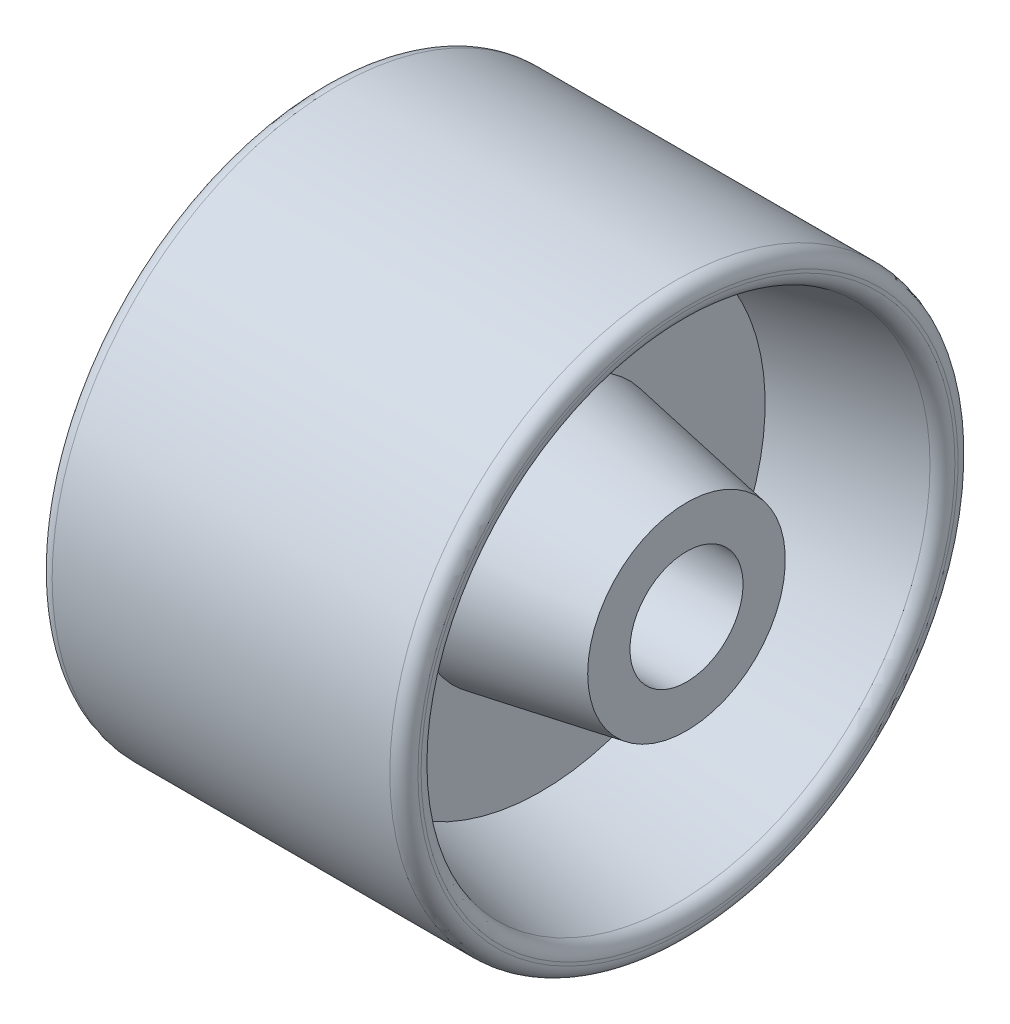
ISO-10303-21;
HEADER;
FILE_DESCRIPTION(('STEP AP214'),'2;1');
FILE_NAME('part.step','',(''),(''),'','','');
FILE_SCHEMA(('AUTOMOTIVE_DESIGN { 1 0 10303 214 1 1 1 1 }'));
ENDSEC;
DATA;
#1=APPLICATION_CONTEXT('core data for automotive mechanical design processes');
#2=APPLICATION_PROTOCOL_DEFINITION('international standard','automotive_design',2000,#1);
#3=PRODUCT_CONTEXT('',#1,'mechanical');
#4=PRODUCT('Part','Part','',(#3));
#5=PRODUCT_RELATED_PRODUCT_CATEGORY('part','',(#4));
#6=PRODUCT_DEFINITION_FORMATION('','',#4);
#7=PRODUCT_DEFINITION_CONTEXT('part definition',#1,'design');
#8=PRODUCT_DEFINITION('design','',#6,#7);
#9=PRODUCT_DEFINITION_SHAPE('','',#8);
#10=(LENGTH_UNIT() NAMED_UNIT(*) SI_UNIT(.MILLI.,.METRE.));
#11=(NAMED_UNIT(*) PLANE_ANGLE_UNIT() SI_UNIT($,.RADIAN.));
#12=(NAMED_UNIT(*) SI_UNIT($,.STERADIAN.) SOLID_ANGLE_UNIT());
#13=UNCERTAINTY_MEASURE_WITH_UNIT(LENGTH_MEASURE(1.E-05),#10,'distance_accuracy_value','');
#14=(GEOMETRIC_REPRESENTATION_CONTEXT(3) GLOBAL_UNCERTAINTY_ASSIGNED_CONTEXT((#13)) GLOBAL_UNIT_ASSIGNED_CONTEXT((#10,
#11,#12)) REPRESENTATION_CONTEXT('',''));
#15=CARTESIAN_POINT('',(0.,0.,0.));
#16=DIRECTION('',(0.,0.,1.));
#17=DIRECTION('',(1.,0.,0.));
#18=AXIS2_PLACEMENT_3D('',#15,#16,#17);
#19=CARTESIAN_POINT('',(-64.9384843005096,90.7268124280783,0.));
#20=DIRECTION('',(1.,0.,0.));
#21=DIRECTION('',(0.,0.,-1.));
#22=AXIS2_PLACEMENT_3D('',#19,#20,#21);
#23=PLANE('',#22);
#24=CARTESIAN_POINT('',(-64.9384843005096,0.,0.));
#25=DIRECTION('',(1.,0.,0.));
#26=DIRECTION('',(0.,0.,-1.));
#27=AXIS2_PLACEMENT_3D('',#24,#25,#26);
#28=CIRCLE('',#27,94.764550954195);
#29=CARTESIAN_POINT('',(-64.9384843005096,0.,-94.764550954195));
#30=VERTEX_POINT('',#29);
#31=EDGE_CURVE('E10',#30,#30,#28,.T.);
#32=ORIENTED_EDGE('',*,*,#31,.T.);
#33=EDGE_LOOP('',(#32));
#34=FACE_BOUND('',#33,.T.);
#35=CARTESIAN_POINT('',(-64.9384843005096,0.,0.));
#36=DIRECTION('',(1.,0.,0.));
#37=DIRECTION('',(0.,0.,-1.));
#38=AXIS2_PLACEMENT_3D('',#35,#36,#37);
#39=CIRCLE('',#38,95.8778029984711);
#40=CARTESIAN_POINT('',(-64.9384843005096,0.,-95.8778029984711));
#41=VERTEX_POINT('',#40);
#42=EDGE_CURVE('E72',#41,#41,#39,.F.);
#43=ORIENTED_EDGE('',*,*,#42,.T.);
#44=EDGE_LOOP('',(#43));
#45=FACE_BOUND('',#44,.T.);
#46=ADVANCED_FACE('F36',(#34,#45),#23,.F.);
#47=CARTESIAN_POINT('',(-64.9384843005096,0.,0.));
#48=DIRECTION('',(-1.,0.,0.));
#49=DIRECTION('',(0.,0.,1.));
#50=AXIS2_PLACEMENT_3D('',#47,#48,#49);
#51=CONICAL_SURFACE('',#50,90.7268124280783,0.212143753004476);
#52=CARTESIAN_POINT('',(-60.9912646802351,0.,0.));
#53=DIRECTION('',(1.,0.,0.));
#54=DIRECTION('',(0.,0.,-1.));
#55=AXIS2_PLACEMENT_3D('',#52,#53,#54);
#56=CIRCLE('',#55,89.8766420483268);
#57=CARTESIAN_POINT('',(-60.9912646802351,0.,-89.8766420483268));
#58=VERTEX_POINT('',#57);
#59=EDGE_CURVE('E44',#58,#58,#56,.F.);
#60=ORIENTED_EDGE('',*,*,#59,.T.);
#61=EDGE_LOOP('',(#60));
#62=FACE_BOUND('',#61,.T.);
#63=CARTESIAN_POINT('',(-12.8273549235575,0.,0.));
#64=DIRECTION('',(-1.,0.,0.));
#65=DIRECTION('',(0.,0.,1.));
#66=AXIS2_PLACEMENT_3D('',#63,#64,#65);
#67=CIRCLE('',#66,79.5028768699655);
#68=CARTESIAN_POINT('',(-12.8273549235575,0.,79.5028768699655));
#69=VERTEX_POINT('',#68);
#70=EDGE_CURVE('E76',#69,#69,#67,.T.);
#71=ORIENTED_EDGE('',*,*,#70,.F.);
#72=EDGE_LOOP('',(#71));
#73=FACE_BOUND('',#72,.T.);
#74=ADVANCED_FACE('F150',(#62,#73),#51,.F.);
#75=CARTESIAN_POINT('',(-12.8273549235573,79.5028768699655,0.));
#76=DIRECTION('',(1.,0.,0.));
#77=DIRECTION('',(0.,0.,-1.));
#78=AXIS2_PLACEMENT_3D('',#75,#76,#77);
#79=PLANE('',#78);
#80=CARTESIAN_POINT('',(-12.8273549235571,0.,0.));
#81=DIRECTION('',(-1.,0.,0.));
#82=DIRECTION('',(0.,0.,1.));
#83=AXIS2_PLACEMENT_3D('',#80,#81,#82);
#84=CIRCLE('',#83,44.1819995166585);
#85=CARTESIAN_POINT('',(-12.8273549235571,0.,44.1819995166585));
#86=VERTEX_POINT('',#85);
#87=EDGE_CURVE('E80',#86,#86,#84,.T.);
#88=ORIENTED_EDGE('',*,*,#87,.F.);
#89=EDGE_LOOP('',(#88));
#90=FACE_BOUND('',#89,.T.);
#91=ORIENTED_EDGE('',*,*,#70,.T.);
#92=EDGE_LOOP('',(#91));
#93=FACE_BOUND('',#92,.T.);
#94=ADVANCED_FACE('F144',(#90,#93),#79,.F.);
#95=CARTESIAN_POINT('',(-12.8273549235571,0.,0.));
#96=DIRECTION('',(1.,0.,0.));
#97=DIRECTION('',(0.,0.,-1.));
#98=AXIS2_PLACEMENT_3D('',#95,#96,#97);
#99=CONICAL_SURFACE('',#98,44.1819995166585,0.174532925199437);
#100=CARTESIAN_POINT('',(-64.4067309339064,0.,0.));
#101=DIRECTION('',(-1.,0.,0.));
#102=DIRECTION('',(0.,0.,1.));
#103=AXIS2_PLACEMENT_3D('',#100,#101,#102);
#104=CIRCLE('',#103,35.0871638779268);
#105=CARTESIAN_POINT('',(-64.4067309339064,0.,35.0871638779268));
#106=VERTEX_POINT('',#105);
#107=EDGE_CURVE('E84',#106,#106,#104,.T.);
#108=ORIENTED_EDGE('',*,*,#107,.F.);
#109=EDGE_LOOP('',(#108));
#110=FACE_BOUND('',#109,.T.);
#111=ORIENTED_EDGE('',*,*,#87,.T.);
#112=EDGE_LOOP('',(#111));
#113=FACE_BOUND('',#112,.T.);
#114=ADVANCED_FACE('F138',(#110,#113),#99,.T.);
#115=CARTESIAN_POINT('',(-64.4067309339064,20.0743372976162,0.));
#116=DIRECTION('',(1.,0.,0.));
#117=DIRECTION('',(0.,0.,-1.));
#118=AXIS2_PLACEMENT_3D('',#115,#116,#117);
#119=PLANE('',#118);
#120=CARTESIAN_POINT('',(-64.4067309339064,0.,0.));
#121=DIRECTION('',(-1.,0.,0.));
#122=DIRECTION('',(0.,0.,1.));
#123=AXIS2_PLACEMENT_3D('',#120,#121,#122);
#124=CIRCLE('',#123,20.0743372976162);
#125=CARTESIAN_POINT('',(-64.4067309339064,0.,20.0743372976162));
#126=VERTEX_POINT('',#125);
#127=EDGE_CURVE('E88',#126,#126,#124,.T.);
#128=ORIENTED_EDGE('',*,*,#127,.F.);
#129=EDGE_LOOP('',(#128));
#130=FACE_BOUND('',#129,.T.);
#131=ORIENTED_EDGE('',*,*,#107,.T.);
#132=EDGE_LOOP('',(#131));
#133=FACE_BOUND('',#132,.T.);
#134=ADVANCED_FACE('F132',(#130,#133),#119,.F.);
#135=CARTESIAN_POINT('',(-142.971560085484,0.,0.));
#136=DIRECTION('',(-1.,0.,0.));
#137=DIRECTION('',(0.,0.,1.));
#138=AXIS2_PLACEMENT_3D('',#135,#136,#137);
#139=CYLINDRICAL_SURFACE('',#138,20.0743372976162);
#140=CARTESIAN_POINT('',(64.4067309339064,0.,0.));
#141=DIRECTION('',(-1.,0.,0.));
#142=DIRECTION('',(0.,0.,1.));
#143=AXIS2_PLACEMENT_3D('',#140,#141,#142);
#144=CIRCLE('',#143,20.0743372976162);
#145=CARTESIAN_POINT('',(64.4067309339064,0.,20.0743372976162));
#146=VERTEX_POINT('',#145);
#147=EDGE_CURVE('E92',#146,#146,#144,.T.);
#148=ORIENTED_EDGE('',*,*,#147,.F.);
#149=EDGE_LOOP('',(#148));
#150=FACE_BOUND('',#149,.T.);
#151=ORIENTED_EDGE('',*,*,#127,.T.);
#152=EDGE_LOOP('',(#151));
#153=FACE_BOUND('',#152,.T.);
#154=ADVANCED_FACE('F126',(#150,#153),#139,.F.);
#155=CARTESIAN_POINT('',(64.4067309339065,20.0743372976162,0.));
#156=DIRECTION('',(-1.,0.,0.));
#157=DIRECTION('',(0.,0.,1.));
#158=AXIS2_PLACEMENT_3D('',#155,#156,#157);
#159=PLANE('',#158);
#160=CARTESIAN_POINT('',(64.4067309339064,0.,0.));
#161=DIRECTION('',(-1.,0.,0.));
#162=DIRECTION('',(0.,0.,1.));
#163=AXIS2_PLACEMENT_3D('',#160,#161,#162);
#164=CIRCLE('',#163,35.0871638779268);
#165=CARTESIAN_POINT('',(64.4067309339064,0.,35.0871638779268));
#166=VERTEX_POINT('',#165);
#167=EDGE_CURVE('E96',#166,#166,#164,.T.);
#168=ORIENTED_EDGE('',*,*,#167,.F.);
#169=EDGE_LOOP('',(#168));
#170=FACE_BOUND('',#169,.T.);
#171=ORIENTED_EDGE('',*,*,#147,.T.);
#172=EDGE_LOOP('',(#171));
#173=FACE_BOUND('',#172,.T.);
#174=ADVANCED_FACE('F120',(#170,#173),#159,.F.);
#175=CARTESIAN_POINT('',(64.4067309339064,0.,0.));
#176=DIRECTION('',(-1.,0.,0.));
#177=DIRECTION('',(0.,0.,1.));
#178=AXIS2_PLACEMENT_3D('',#175,#176,#177);
#179=CONICAL_SURFACE('',#178,35.0871638779268,0.174532925199449);
#180=CARTESIAN_POINT('',(12.8273549235575,0.,0.));
#181=DIRECTION('',(-1.,0.,0.));
#182=DIRECTION('',(0.,0.,1.));
#183=AXIS2_PLACEMENT_3D('',#180,#181,#182);
#184=CIRCLE('',#183,44.1819995166591);
#185=CARTESIAN_POINT('',(12.8273549235575,0.,44.1819995166591));
#186=VERTEX_POINT('',#185);
#187=EDGE_CURVE('E100',#186,#186,#184,.T.);
#188=ORIENTED_EDGE('',*,*,#187,.F.);
#189=EDGE_LOOP('',(#188));
#190=FACE_BOUND('',#189,.T.);
#191=ORIENTED_EDGE('',*,*,#167,.T.);
#192=EDGE_LOOP('',(#191));
#193=FACE_BOUND('',#192,.T.);
#194=ADVANCED_FACE('F114',(#190,#193),#179,.T.);
#195=CARTESIAN_POINT('',(12.8273549235575,79.5028768699655,0.));
#196=DIRECTION('',(-1.,0.,0.));
#197=DIRECTION('',(0.,0.,1.));
#198=AXIS2_PLACEMENT_3D('',#195,#196,#197);
#199=PLANE('',#198);
#200=CARTESIAN_POINT('',(12.8273549235575,0.,0.));
#201=DIRECTION('',(-1.,0.,0.));
#202=DIRECTION('',(0.,0.,1.));
#203=AXIS2_PLACEMENT_3D('',#200,#201,#202);
#204=CIRCLE('',#203,79.5028768699655);
#205=CARTESIAN_POINT('',(12.8273549235575,0.,79.5028768699655));
#206=VERTEX_POINT('',#205);
#207=EDGE_CURVE('E104',#206,#206,#204,.T.);
#208=ORIENTED_EDGE('',*,*,#207,.F.);
#209=EDGE_LOOP('',(#208));
#210=FACE_BOUND('',#209,.T.);
#211=ORIENTED_EDGE('',*,*,#187,.T.);
#212=EDGE_LOOP('',(#211));
#213=FACE_BOUND('',#212,.T.);
#214=ADVANCED_FACE('F111',(#210,#213),#199,.F.);
#215=CARTESIAN_POINT('',(12.8273549235575,0.,0.));
#216=DIRECTION('',(1.,0.,0.));
#217=DIRECTION('',(0.,0.,-1.));
#218=AXIS2_PLACEMENT_3D('',#215,#216,#217);
#219=CONICAL_SURFACE('',#218,79.5028768699655,0.212143753004476);
#220=CARTESIAN_POINT('',(60.9912646802351,0.,0.));
#221=DIRECTION('',(-1.,0.,0.));
#222=DIRECTION('',(0.,0.,1.));
#223=AXIS2_PLACEMENT_3D('',#220,#221,#222);
#224=CIRCLE('',#223,89.8766420483268);
#225=CARTESIAN_POINT('',(60.9912646802351,0.,89.8766420483268));
#226=VERTEX_POINT('',#225);
#227=EDGE_CURVE('E54',#226,#226,#224,.F.);
#228=ORIENTED_EDGE('',*,*,#227,.T.);
#229=EDGE_LOOP('',(#228));
#230=FACE_BOUND('',#229,.T.);
#231=ORIENTED_EDGE('',*,*,#207,.T.);
#232=EDGE_LOOP('',(#231));
#233=FACE_BOUND('',#232,.T.);
#234=ADVANCED_FACE('F109',(#230,#233),#219,.F.);
#235=CARTESIAN_POINT('',(64.9384843005096,90.7268124280783,0.));
#236=DIRECTION('',(-1.,0.,0.));
#237=DIRECTION('',(0.,0.,1.));
#238=AXIS2_PLACEMENT_3D('',#235,#236,#237);
#239=PLANE('',#238);
#240=CARTESIAN_POINT('',(64.9384843005096,0.,0.));
#241=DIRECTION('',(-1.,0.,0.));
#242=DIRECTION('',(0.,0.,1.));
#243=AXIS2_PLACEMENT_3D('',#240,#241,#242);
#244=CIRCLE('',#243,94.764550954195);
#245=CARTESIAN_POINT('',(64.9384843005096,0.,94.764550954195));
#246=VERTEX_POINT('',#245);
#247=EDGE_CURVE('E60',#246,#246,#244,.T.);
#248=ORIENTED_EDGE('',*,*,#247,.T.);
#249=EDGE_LOOP('',(#248));
#250=FACE_BOUND('',#249,.T.);
#251=CARTESIAN_POINT('',(64.9384843005096,0.,0.));
#252=DIRECTION('',(-1.,0.,0.));
#253=DIRECTION('',(0.,0.,1.));
#254=AXIS2_PLACEMENT_3D('',#251,#252,#253);
#255=CIRCLE('',#254,95.8778029984711);
#256=CARTESIAN_POINT('',(64.9384843005096,0.,95.8778029984711));
#257=VERTEX_POINT('',#256);
#258=EDGE_CURVE('E64',#257,#257,#255,.F.);
#259=ORIENTED_EDGE('',*,*,#258,.T.);
#260=EDGE_LOOP('',(#259));
#261=FACE_BOUND('',#260,.T.);
#262=ADVANCED_FACE('F182',(#250,#261),#239,.F.);
#263=CARTESIAN_POINT('',(-142.971560085484,0.,0.));
#264=DIRECTION('',(-1.,0.,0.));
#265=DIRECTION('',(0.,0.,1.));
#266=AXIS2_PLACEMENT_3D('',#263,#264,#265);
#267=CYLINDRICAL_SURFACE('',#266,100.877802998471);
#268=CARTESIAN_POINT('',(59.9384843005096,0.,0.));
#269=DIRECTION('',(-1.,0.,0.));
#270=DIRECTION('',(0.,0.,1.));
#271=AXIS2_PLACEMENT_3D('',#268,#269,#270);
#272=CIRCLE('',#271,100.877802998471);
#273=CARTESIAN_POINT('',(59.9384843005096,0.,100.877802998471));
#274=VERTEX_POINT('',#273);
#275=EDGE_CURVE('E49',#274,#274,#272,.T.);
#276=ORIENTED_EDGE('',*,*,#275,.T.);
#277=EDGE_LOOP('',(#276));
#278=FACE_BOUND('',#277,.T.);
#279=CARTESIAN_POINT('',(-59.9384843005096,0.,0.));
#280=DIRECTION('',(1.,0.,0.));
#281=DIRECTION('',(0.,0.,-1.));
#282=AXIS2_PLACEMENT_3D('',#279,#280,#281);
#283=CIRCLE('',#282,100.877802998471);
#284=CARTESIAN_POINT('',(-59.9384843005096,0.,-100.877802998471));
#285=VERTEX_POINT('',#284);
#286=EDGE_CURVE('E68',#285,#285,#283,.T.);
#287=ORIENTED_EDGE('',*,*,#286,.T.);
#288=EDGE_LOOP('',(#287));
#289=FACE_BOUND('',#288,.T.);
#290=ADVANCED_FACE('F165',(#278,#289),#267,.T.);
#291=CARTESIAN_POINT('',(-59.9384843005096,0.,0.));
#292=DIRECTION('',(1.,0.,0.));
#293=DIRECTION('',(0.,0.,-1.));
#294=AXIS2_PLACEMENT_3D('',#291,#292,#293);
#295=TOROIDAL_SURFACE('',#294,95.8778029984711,5.);
#296=ORIENTED_EDGE('',*,*,#286,.F.);
#297=EDGE_LOOP('',(#296));
#298=FACE_BOUND('',#297,.T.);
#299=ORIENTED_EDGE('',*,*,#42,.F.);
#300=EDGE_LOOP('',(#299));
#301=FACE_BOUND('',#300,.T.);
#302=ADVANCED_FACE('F161',(#298,#301),#295,.T.);
#303=CARTESIAN_POINT('',(59.9384843005096,0.,0.));
#304=DIRECTION('',(-1.,0.,0.));
#305=DIRECTION('',(0.,0.,1.));
#306=AXIS2_PLACEMENT_3D('',#303,#304,#305);
#307=TOROIDAL_SURFACE('',#306,94.764550954195,5.);
#308=ORIENTED_EDGE('',*,*,#227,.F.);
#309=EDGE_LOOP('',(#308));
#310=FACE_BOUND('',#309,.T.);
#311=ORIENTED_EDGE('',*,*,#247,.F.);
#312=EDGE_LOOP('',(#311));
#313=FACE_BOUND('',#312,.T.);
#314=ADVANCED_FACE('F164',(#310,#313),#307,.T.);
#315=CARTESIAN_POINT('',(59.9384843005096,0.,0.));
#316=DIRECTION('',(-1.,0.,0.));
#317=DIRECTION('',(0.,0.,1.));
#318=AXIS2_PLACEMENT_3D('',#315,#316,#317);
#319=TOROIDAL_SURFACE('',#318,95.8778029984711,5.);
#320=ORIENTED_EDGE('',*,*,#258,.F.);
#321=EDGE_LOOP('',(#320));
#322=FACE_BOUND('',#321,.T.);
#323=ORIENTED_EDGE('',*,*,#275,.F.);
#324=EDGE_LOOP('',(#323));
#325=FACE_BOUND('',#324,.T.);
#326=ADVANCED_FACE('F168',(#322,#325),#319,.T.);
#327=CARTESIAN_POINT('',(-59.9384843005096,0.,0.));
#328=DIRECTION('',(1.,0.,0.));
#329=DIRECTION('',(0.,0.,-1.));
#330=AXIS2_PLACEMENT_3D('',#327,#328,#329);
#331=TOROIDAL_SURFACE('',#330,94.764550954195,5.);
#332=ORIENTED_EDGE('',*,*,#31,.F.);
#333=EDGE_LOOP('',(#332));
#334=FACE_BOUND('',#333,.T.);
#335=ORIENTED_EDGE('',*,*,#59,.F.);
#336=EDGE_LOOP('',(#335));
#337=FACE_BOUND('',#336,.T.);
#338=ADVANCED_FACE('F38',(#334,#337),#331,.T.);
#339=CLOSED_SHELL('',(#46,#74,#94,#114,#134,#154,#174,#194,#214,#234,#262,#290,#302,#314,#326,#338));
#340=MANIFOLD_SOLID_BREP('B2',#339);
#341=ADVANCED_BREP_SHAPE_REPRESENTATION('',(#18,#340),#14);
#342=SHAPE_DEFINITION_REPRESENTATION(#9,#341);
ENDSEC;
END-ISO-10303-21;
